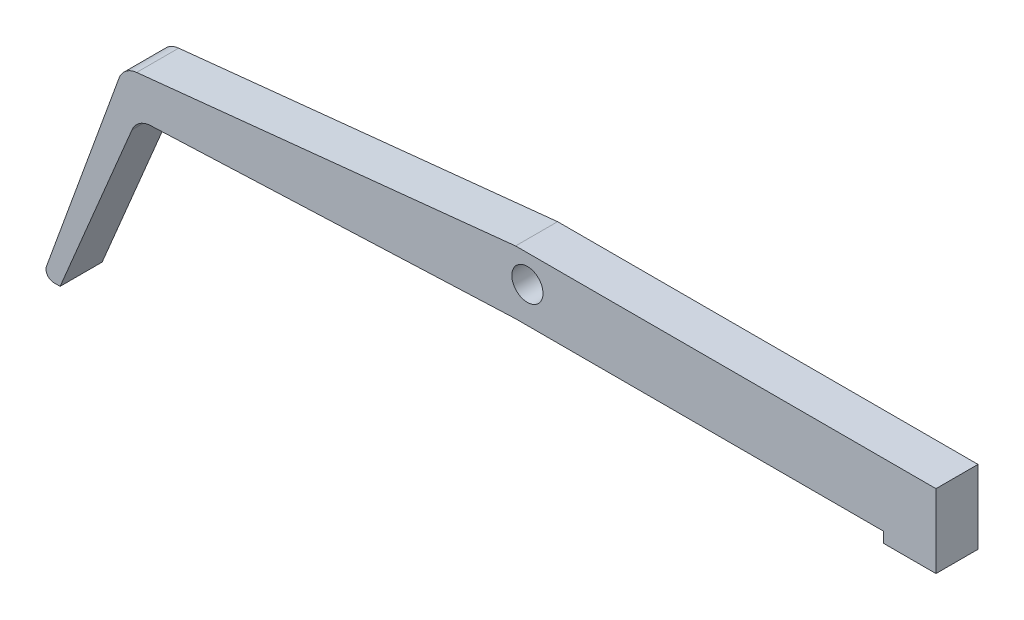
ISO-10303-21;
HEADER;
FILE_DESCRIPTION(('STEP AP214'),'2;1');
FILE_NAME('part.step','',(''),(''),'','','');
FILE_SCHEMA(('AUTOMOTIVE_DESIGN { 1 0 10303 214 1 1 1 1 }'));
ENDSEC;
DATA;
#1=APPLICATION_CONTEXT('core data for automotive mechanical design processes');
#2=APPLICATION_PROTOCOL_DEFINITION('international standard','automotive_design',2000,#1);
#3=PRODUCT_CONTEXT('',#1,'mechanical');
#4=PRODUCT('Part','Part','',(#3));
#5=PRODUCT_RELATED_PRODUCT_CATEGORY('part','',(#4));
#6=PRODUCT_DEFINITION_FORMATION('','',#4);
#7=PRODUCT_DEFINITION_CONTEXT('part definition',#1,'design');
#8=PRODUCT_DEFINITION('design','',#6,#7);
#9=PRODUCT_DEFINITION_SHAPE('','',#8);
#10=(LENGTH_UNIT() NAMED_UNIT(*) SI_UNIT(.MILLI.,.METRE.));
#11=(NAMED_UNIT(*) PLANE_ANGLE_UNIT() SI_UNIT($,.RADIAN.));
#12=(NAMED_UNIT(*) SI_UNIT($,.STERADIAN.) SOLID_ANGLE_UNIT());
#13=UNCERTAINTY_MEASURE_WITH_UNIT(LENGTH_MEASURE(1.E-05),#10,'distance_accuracy_value','');
#14=(GEOMETRIC_REPRESENTATION_CONTEXT(3) GLOBAL_UNCERTAINTY_ASSIGNED_CONTEXT((#13)) GLOBAL_UNIT_ASSIGNED_CONTEXT((#10,
#11,#12)) REPRESENTATION_CONTEXT('',''));
#15=CARTESIAN_POINT('',(0.,0.,0.));
#16=DIRECTION('',(0.,0.,1.));
#17=DIRECTION('',(1.,0.,0.));
#18=AXIS2_PLACEMENT_3D('',#15,#16,#17);
#19=CARTESIAN_POINT('',(77.7468093093093,38.75,8.));
#20=DIRECTION('',(-1.,0.,0.));
#21=DIRECTION('',(0.,0.,1.));
#22=AXIS2_PLACEMENT_3D('',#19,#20,#21);
#23=PLANE('',#22);
#24=DIRECTION('',(0.,1.,0.));
#25=VECTOR('',#24,1.);
#26=CARTESIAN_POINT('',(77.7468093093093,38.75,0.));
#27=LINE('',#26,#25);
#28=CARTESIAN_POINT('',(77.7468093093093,24.75,0.));
#29=VERTEX_POINT('',#28);
#30=CARTESIAN_POINT('',(77.7468093093093,38.75,0.));
#31=VERTEX_POINT('',#30);
#32=EDGE_CURVE('E172',#29,#31,#27,.T.);
#33=ORIENTED_EDGE('',*,*,#32,.T.);
#34=DIRECTION('',(0.,0.,-1.));
#35=VECTOR('',#34,1.);
#36=CARTESIAN_POINT('',(77.7468093093093,38.75,8.));
#37=LINE('',#36,#35);
#38=CARTESIAN_POINT('',(77.7468093093093,38.75,8.));
#39=VERTEX_POINT('',#38);
#40=EDGE_CURVE('E312',#39,#31,#37,.T.);
#41=ORIENTED_EDGE('',*,*,#40,.F.);
#42=DIRECTION('',(0.,1.,0.));
#43=VECTOR('',#42,1.);
#44=CARTESIAN_POINT('',(77.7468093093093,38.75,8.));
#45=LINE('',#44,#43);
#46=CARTESIAN_POINT('',(77.7468093093093,24.75,8.));
#47=VERTEX_POINT('',#46);
#48=EDGE_CURVE('E246',#47,#39,#45,.T.);
#49=ORIENTED_EDGE('',*,*,#48,.F.);
#50=DIRECTION('',(0.,0.,1.));
#51=VECTOR('',#50,1.);
#52=CARTESIAN_POINT('',(77.7468093093093,24.75,0.));
#53=LINE('',#52,#51);
#54=EDGE_CURVE('E209',#29,#47,#53,.T.);
#55=ORIENTED_EDGE('',*,*,#54,.F.);
#56=EDGE_LOOP('',(#33,#41,#49,#55));
#57=FACE_BOUND('',#56,.T.);
#58=ADVANCED_FACE('F41',(#57),#23,.F.);
#59=CARTESIAN_POINT('',(77.7468093093093,38.75,8.));
#60=DIRECTION('',(0.,-1.,0.));
#61=DIRECTION('',(0.,0.,-1.));
#62=AXIS2_PLACEMENT_3D('',#59,#60,#61);
#63=PLANE('',#62);
#64=DIRECTION('',(-1.,0.,0.));
#65=VECTOR('',#64,1.);
#66=CARTESIAN_POINT('',(77.7468093093093,38.75,0.));
#67=LINE('',#66,#65);
#68=CARTESIAN_POINT('',(-2.25319069069069,38.75,0.));
#69=VERTEX_POINT('',#68);
#70=EDGE_CURVE('E279',#31,#69,#67,.T.);
#71=ORIENTED_EDGE('',*,*,#70,.T.);
#72=DIRECTION('',(0.,0.,-1.));
#73=VECTOR('',#72,1.);
#74=CARTESIAN_POINT('',(-2.25319069069069,38.75,8.));
#75=LINE('',#74,#73);
#76=CARTESIAN_POINT('',(-2.25319069069069,38.75,8.));
#77=VERTEX_POINT('',#76);
#78=EDGE_CURVE('E308',#77,#69,#75,.T.);
#79=ORIENTED_EDGE('',*,*,#78,.F.);
#80=DIRECTION('',(-1.,0.,0.));
#81=VECTOR('',#80,1.);
#82=CARTESIAN_POINT('',(77.7468093093093,38.75,8.));
#83=LINE('',#82,#81);
#84=EDGE_CURVE('E250',#39,#77,#83,.T.);
#85=ORIENTED_EDGE('',*,*,#84,.F.);
#86=ORIENTED_EDGE('',*,*,#40,.T.);
#87=EDGE_LOOP('',(#71,#79,#85,#86));
#88=FACE_BOUND('',#87,.T.);
#89=ADVANCED_FACE('F392',(#88),#63,.F.);
#90=CARTESIAN_POINT('',(-2.25319069069069,38.75,8.));
#91=DIRECTION('',(0.102885577031586,-0.994693197945416,0.));
#92=DIRECTION('',(0.994693197945416,0.102885577031586,0.));
#93=AXIS2_PLACEMENT_3D('',#90,#91,#92);
#94=PLANE('',#93);
#95=DIRECTION('',(-0.994693197945415,-0.102885577031586,0.));
#96=VECTOR('',#95,1.);
#97=CARTESIAN_POINT('',(-2.25319069069069,38.75,0.));
#98=LINE('',#97,#96);
#99=CARTESIAN_POINT('',(-74.3648610289055,31.2911666343114,0.));
#100=VERTEX_POINT('',#99);
#101=EDGE_CURVE('E282',#69,#100,#98,.T.);
#102=ORIENTED_EDGE('',*,*,#101,.T.);
#103=DIRECTION('',(0.,0.,-1.));
#104=VECTOR('',#103,1.);
#105=CARTESIAN_POINT('',(-74.3648610289055,31.2911666343114,8.));
#106=LINE('',#105,#104);
#107=CARTESIAN_POINT('',(-74.3648610289055,31.2911666343114,8.));
#108=VERTEX_POINT('',#107);
#109=EDGE_CURVE('E330',#100,#108,#106,.F.);
#110=ORIENTED_EDGE('',*,*,#109,.T.);
#111=DIRECTION('',(-0.994693197945415,-0.102885577031586,0.));
#112=VECTOR('',#111,1.);
#113=CARTESIAN_POINT('',(-2.25319069069069,38.75,8.));
#114=LINE('',#113,#112);
#115=EDGE_CURVE('E254',#77,#108,#114,.T.);
#116=ORIENTED_EDGE('',*,*,#115,.F.);
#117=ORIENTED_EDGE('',*,*,#78,.T.);
#118=EDGE_LOOP('',(#102,#110,#116,#117));
#119=FACE_BOUND('',#118,.T.);
#120=ADVANCED_FACE('F398',(#119),#94,.F.);
#121=CARTESIAN_POINT('',(-76.8551805365968,31.0335817226311,8.));
#122=DIRECTION('',(0.939635149391802,-0.342178003424307,0.));
#123=DIRECTION('',(0.342178003424307,0.939635149391802,0.));
#124=AXIS2_PLACEMENT_3D('',#121,#122,#123);
#125=PLANE('',#124);
#126=DIRECTION('',(-0.342178003424307,-0.939635149391802,0.));
#127=VECTOR('',#126,1.);
#128=CARTESIAN_POINT('',(-76.8551805365968,31.0335817226311,0.));
#129=LINE('',#128,#127);
#130=CARTESIAN_POINT('',(-77.7118593183464,28.681105856227,0.));
#131=VERTEX_POINT('',#130);
#132=CARTESIAN_POINT('',(-91.5200383765999,-9.23673299486357,0.));
#133=VERTEX_POINT('',#132);
#134=EDGE_CURVE('E286',#131,#133,#129,.T.);
#135=ORIENTED_EDGE('',*,*,#134,.T.);
#136=DIRECTION('',(0.,0.,-1.));
#137=VECTOR('',#136,1.);
#138=CARTESIAN_POINT('',(-91.5200383765999,-9.23673299486357,8.));
#139=LINE('',#138,#137);
#140=CARTESIAN_POINT('',(-91.5200383765999,-9.23673299486357,8.));
#141=VERTEX_POINT('',#140);
#142=EDGE_CURVE('E50',#133,#141,#139,.F.);
#143=ORIENTED_EDGE('',*,*,#142,.T.);
#144=DIRECTION('',(-0.342178003424307,-0.939635149391802,0.));
#145=VECTOR('',#144,1.);
#146=CARTESIAN_POINT('',(-76.8551805365968,31.0335817226311,8.));
#147=LINE('',#146,#145);
#148=CARTESIAN_POINT('',(-77.7118593183464,28.681105856227,8.));
#149=VERTEX_POINT('',#148);
#150=EDGE_CURVE('E258',#149,#141,#147,.T.);
#151=ORIENTED_EDGE('',*,*,#150,.F.);
#152=DIRECTION('',(0.,0.,-1.));
#153=VECTOR('',#152,1.);
#154=CARTESIAN_POINT('',(-77.7118593183464,28.681105856227,8.));
#155=LINE('',#154,#153);
#156=EDGE_CURVE('E323',#149,#131,#155,.T.);
#157=ORIENTED_EDGE('',*,*,#156,.T.);
#158=EDGE_LOOP('',(#135,#143,#151,#157));
#159=FACE_BOUND('',#158,.T.);
#160=ADVANCED_FACE('F417',(#159),#125,.F.);
#161=CARTESIAN_POINT('',(-88.9231906906907,-11.25,8.));
#162=DIRECTION('',(0.,1.,0.));
#163=DIRECTION('',(-1.,0.,0.));
#164=AXIS2_PLACEMENT_3D('',#161,#162,#163);
#165=PLANE('',#164);
#166=DIRECTION('',(1.,0.,0.));
#167=VECTOR('',#166,1.);
#168=CARTESIAN_POINT('',(-88.9231906906907,-11.25,8.));
#169=LINE('',#168,#167);
#170=CARTESIAN_POINT('',(-90.1105856525122,-11.25,8.));
#171=VERTEX_POINT('',#170);
#172=CARTESIAN_POINT('',(-88.9231906906907,-11.25,8.));
#173=VERTEX_POINT('',#172);
#174=EDGE_CURVE('E261',#171,#173,#169,.T.);
#175=ORIENTED_EDGE('',*,*,#174,.F.);
#176=DIRECTION('',(0.,0.,-1.));
#177=VECTOR('',#176,1.);
#178=CARTESIAN_POINT('',(-90.1105856525122,-11.25,8.));
#179=LINE('',#178,#177);
#180=CARTESIAN_POINT('',(-90.1105856525122,-11.25,0.));
#181=VERTEX_POINT('',#180);
#182=EDGE_CURVE('E342',#171,#181,#179,.T.);
#183=ORIENTED_EDGE('',*,*,#182,.T.);
#184=DIRECTION('',(1.,0.,0.));
#185=VECTOR('',#184,1.);
#186=CARTESIAN_POINT('',(-88.9231906906907,-11.25,0.));
#187=LINE('',#186,#185);
#188=CARTESIAN_POINT('',(-88.9231906906907,-11.25,0.));
#189=VERTEX_POINT('',#188);
#190=EDGE_CURVE('E289',#181,#189,#187,.T.);
#191=ORIENTED_EDGE('',*,*,#190,.T.);
#192=DIRECTION('',(0.,0.,-1.));
#193=VECTOR('',#192,1.);
#194=CARTESIAN_POINT('',(-88.9231906906907,-11.25,8.));
#195=LINE('',#194,#193);
#196=EDGE_CURVE('E304',#173,#189,#195,.T.);
#197=ORIENTED_EDGE('',*,*,#196,.F.);
#198=EDGE_LOOP('',(#175,#183,#191,#197));
#199=FACE_BOUND('',#198,.T.);
#200=ADVANCED_FACE('F351',(#199),#165,.F.);
#201=CARTESIAN_POINT('',(-74.2531906906907,23.75,8.));
#202=DIRECTION('',(-0.922264090472131,0.386560405920747,0.));
#203=DIRECTION('',(-0.386560405920747,-0.922264090472131,0.));
#204=AXIS2_PLACEMENT_3D('',#201,#202,#203);
#205=PLANE('',#204);
#206=DIRECTION('',(0.386560405920747,0.922264090472131,0.));
#207=VECTOR('',#206,1.);
#208=CARTESIAN_POINT('',(-74.2531906906907,23.75,0.));
#209=LINE('',#208,#207);
#210=CARTESIAN_POINT('',(-75.2358555182941,21.4055372211234,0.));
#211=VERTEX_POINT('',#210);
#212=EDGE_CURVE('E292',#189,#211,#209,.T.);
#213=ORIENTED_EDGE('',*,*,#212,.T.);
#214=DIRECTION('',(0.,0.,-1.));
#215=VECTOR('',#214,1.);
#216=CARTESIAN_POINT('',(-75.2358555182941,21.4055372211234,8.));
#217=LINE('',#216,#215);
#218=CARTESIAN_POINT('',(-75.2358555182941,21.4055372211234,8.));
#219=VERTEX_POINT('',#218);
#220=EDGE_CURVE('E320',#211,#219,#217,.F.);
#221=ORIENTED_EDGE('',*,*,#220,.T.);
#222=DIRECTION('',(0.386560405920747,0.922264090472131,0.));
#223=VECTOR('',#222,1.);
#224=CARTESIAN_POINT('',(-74.2531906906907,23.75,8.));
#225=LINE('',#224,#223);
#226=EDGE_CURVE('E264',#173,#219,#225,.T.);
#227=ORIENTED_EDGE('',*,*,#226,.F.);
#228=ORIENTED_EDGE('',*,*,#196,.T.);
#229=EDGE_LOOP('',(#213,#221,#227,#228));
#230=FACE_BOUND('',#229,.T.);
#231=ADVANCED_FACE('F360',(#230),#205,.F.);
#232=CARTESIAN_POINT('',(-2.25319069069069,26.75,8.));
#233=DIRECTION('',(-0.0416305447121813,0.999133073092352,0.));
#234=DIRECTION('',(-0.999133073092352,-0.0416305447121813,0.));
#235=AXIS2_PLACEMENT_3D('',#232,#233,#234);
#236=PLANE('',#235);
#237=DIRECTION('',(0.999133073092352,0.0416305447121813,0.));
#238=VECTOR('',#237,1.);
#239=CARTESIAN_POINT('',(-2.25319069069069,26.75,8.));
#240=LINE('',#239,#238);
#241=CARTESIAN_POINT('',(-71.7133213352543,23.8558278898098,8.));
#242=VERTEX_POINT('',#241);
#243=CARTESIAN_POINT('',(-2.25319069069069,26.75,8.));
#244=VERTEX_POINT('',#243);
#245=EDGE_CURVE('E268',#242,#244,#240,.T.);
#246=ORIENTED_EDGE('',*,*,#245,.F.);
#247=DIRECTION('',(0.,0.,-1.));
#248=VECTOR('',#247,1.);
#249=CARTESIAN_POINT('',(-71.7133213352543,23.8558278898098,0.));
#250=LINE('',#249,#248);
#251=CARTESIAN_POINT('',(-71.7133213352543,23.8558278898098,0.));
#252=VERTEX_POINT('',#251);
#253=EDGE_CURVE('E316',#242,#252,#250,.T.);
#254=ORIENTED_EDGE('',*,*,#253,.T.);
#255=DIRECTION('',(0.999133073092352,0.0416305447121813,0.));
#256=VECTOR('',#255,1.);
#257=CARTESIAN_POINT('',(-2.25319069069069,26.75,0.));
#258=LINE('',#257,#256);
#259=CARTESIAN_POINT('',(-2.25319069069069,26.75,0.));
#260=VERTEX_POINT('',#259);
#261=EDGE_CURVE('E296',#252,#260,#258,.T.);
#262=ORIENTED_EDGE('',*,*,#261,.T.);
#263=DIRECTION('',(0.,0.,-1.));
#264=VECTOR('',#263,1.);
#265=CARTESIAN_POINT('',(-2.25319069069069,26.75,8.));
#266=LINE('',#265,#264);
#267=EDGE_CURVE('E275',#244,#260,#266,.T.);
#268=ORIENTED_EDGE('',*,*,#267,.F.);
#269=EDGE_LOOP('',(#246,#254,#262,#268));
#270=FACE_BOUND('',#269,.T.);
#271=ADVANCED_FACE('F371',(#270),#236,.F.);
#272=CARTESIAN_POINT('',(77.7468093093093,26.75,8.));
#273=DIRECTION('',(0.,1.,0.));
#274=DIRECTION('',(0.,0.,1.));
#275=AXIS2_PLACEMENT_3D('',#272,#273,#274);
#276=PLANE('',#275);
#277=DIRECTION('',(1.,0.,0.));
#278=VECTOR('',#277,1.);
#279=CARTESIAN_POINT('',(77.7468093093093,26.75,0.));
#280=LINE('',#279,#278);
#281=CARTESIAN_POINT('',(67.7468093093093,26.75,0.));
#282=VERTEX_POINT('',#281);
#283=EDGE_CURVE('E251',#260,#282,#280,.T.);
#284=ORIENTED_EDGE('',*,*,#283,.T.);
#285=DIRECTION('',(0.,0.,1.));
#286=VECTOR('',#285,1.);
#287=CARTESIAN_POINT('',(67.7468093093093,26.75,0.));
#288=LINE('',#287,#286);
#289=CARTESIAN_POINT('',(67.7468093093093,26.75,1.6));
#290=VERTEX_POINT('',#289);
#291=EDGE_CURVE('E193',#282,#290,#288,.T.);
#292=ORIENTED_EDGE('',*,*,#291,.T.);
#293=DIRECTION('',(-1.,0.,0.));
#294=VECTOR('',#293,1.);
#295=CARTESIAN_POINT('',(0.,26.75,1.60000000000001));
#296=LINE('',#295,#294);
#297=CARTESIAN_POINT('',(76.1468093093093,26.75,1.6));
#298=VERTEX_POINT('',#297);
#299=EDGE_CURVE('E224',#298,#290,#296,.T.);
#300=ORIENTED_EDGE('',*,*,#299,.F.);
#301=DIRECTION('',(0.,0.,-1.));
#302=VECTOR('',#301,1.);
#303=CARTESIAN_POINT('',(76.1468093093093,26.75,0.));
#304=LINE('',#303,#302);
#305=CARTESIAN_POINT('',(76.1468093093093,26.75,6.4));
#306=VERTEX_POINT('',#305);
#307=EDGE_CURVE('E221',#306,#298,#304,.T.);
#308=ORIENTED_EDGE('',*,*,#307,.F.);
#309=DIRECTION('',(-1.,0.,0.));
#310=VECTOR('',#309,1.);
#311=CARTESIAN_POINT('',(0.,26.75,6.39999999999999));
#312=LINE('',#311,#310);
#313=CARTESIAN_POINT('',(67.7468093093093,26.75,6.4));
#314=VERTEX_POINT('',#313);
#315=EDGE_CURVE('E168',#306,#314,#312,.T.);
#316=ORIENTED_EDGE('',*,*,#315,.T.);
#317=DIRECTION('',(0.,0.,-1.));
#318=VECTOR('',#317,1.);
#319=CARTESIAN_POINT('',(67.7468093093093,26.75,0.));
#320=LINE('',#319,#318);
#321=CARTESIAN_POINT('',(67.7468093093093,26.75,8.));
#322=VERTEX_POINT('',#321);
#323=EDGE_CURVE('E189',#322,#314,#320,.T.);
#324=ORIENTED_EDGE('',*,*,#323,.F.);
#325=DIRECTION('',(1.,0.,0.));
#326=VECTOR('',#325,1.);
#327=CARTESIAN_POINT('',(77.7468093093093,26.75,8.));
#328=LINE('',#327,#326);
#329=EDGE_CURVE('E271',#244,#322,#328,.T.);
#330=ORIENTED_EDGE('',*,*,#329,.F.);
#331=ORIENTED_EDGE('',*,*,#267,.T.);
#332=EDGE_LOOP('',(#284,#292,#300,#308,#316,#324,#330,#331));
#333=FACE_BOUND('',#332,.T.);
#334=ADVANCED_FACE('F375',(#333),#276,.F.);
#335=CARTESIAN_POINT('',(0.,0.,8.));
#336=DIRECTION('',(0.,0.,-1.));
#337=DIRECTION('',(-1.,0.,0.));
#338=AXIS2_PLACEMENT_3D('',#335,#336,#337);
#339=PLANE('',#338);
#340=CARTESIAN_POINT('',(0.,33.532902176458,8.));
#341=DIRECTION('',(0.,0.,-1.));
#342=DIRECTION('',(-1.,0.,0.));
#343=AXIS2_PLACEMENT_3D('',#340,#341,#342);
#344=CIRCLE('',#343,2.96650393068115);
#345=CARTESIAN_POINT('',(-2.96650393068115,33.532902176458,8.));
#346=VERTEX_POINT('',#345);
#347=EDGE_CURVE('E196',#346,#346,#344,.T.);
#348=ORIENTED_EDGE('',*,*,#347,.T.);
#349=EDGE_LOOP('',(#348));
#350=FACE_BOUND('',#349,.T.);
#351=ORIENTED_EDGE('',*,*,#150,.T.);
#352=CARTESIAN_POINT('',(-90.1105856525122,-9.75000000000003,8.));
#353=DIRECTION('',(0.,0.,-1.));
#354=DIRECTION('',(-1.,0.,0.));
#355=AXIS2_PLACEMENT_3D('',#352,#353,#354);
#356=CIRCLE('',#355,1.5);
#357=EDGE_CURVE('E11',#141,#171,#356,.F.);
#358=ORIENTED_EDGE('',*,*,#357,.T.);
#359=ORIENTED_EDGE('',*,*,#174,.T.);
#360=ORIENTED_EDGE('',*,*,#226,.T.);
#361=CARTESIAN_POINT('',(-71.5467991564056,19.8592955974404,8.));
#362=DIRECTION('',(0.,0.,-1.));
#363=DIRECTION('',(-1.,0.,0.));
#364=AXIS2_PLACEMENT_3D('',#361,#362,#363);
#365=CIRCLE('',#364,4.);
#366=EDGE_CURVE('E339',#219,#242,#365,.T.);
#367=ORIENTED_EDGE('',*,*,#366,.T.);
#368=ORIENTED_EDGE('',*,*,#245,.T.);
#369=ORIENTED_EDGE('',*,*,#329,.T.);
#370=DIRECTION('',(0.,1.,0.));
#371=VECTOR('',#370,1.);
#372=CARTESIAN_POINT('',(67.7468093093093,24.75,8.));
#373=LINE('',#372,#371);
#374=CARTESIAN_POINT('',(67.7468093093093,24.75,8.));
#375=VERTEX_POINT('',#374);
#376=EDGE_CURVE('E232',#375,#322,#373,.T.);
#377=ORIENTED_EDGE('',*,*,#376,.F.);
#378=DIRECTION('',(-1.,0.,0.));
#379=VECTOR('',#378,1.);
#380=CARTESIAN_POINT('',(0.,24.75,8.));
#381=LINE('',#380,#379);
#382=EDGE_CURVE('E213',#47,#375,#381,.T.);
#383=ORIENTED_EDGE('',*,*,#382,.F.);
#384=ORIENTED_EDGE('',*,*,#48,.T.);
#385=ORIENTED_EDGE('',*,*,#84,.T.);
#386=ORIENTED_EDGE('',*,*,#115,.T.);
#387=CARTESIAN_POINT('',(-73.9533187207792,27.3123938425298,8.));
#388=DIRECTION('',(0.,0.,-1.));
#389=DIRECTION('',(-1.,0.,0.));
#390=AXIS2_PLACEMENT_3D('',#387,#388,#389);
#391=CIRCLE('',#390,4.);
#392=EDGE_CURVE('E333',#108,#149,#391,.F.);
#393=ORIENTED_EDGE('',*,*,#392,.T.);
#394=EDGE_LOOP('',(#351,#358,#359,#360,#367,#368,#369,#377,#383,#384,#385,#386,#393));
#395=FACE_BOUND('',#394,.T.);
#396=ADVANCED_FACE('F368',(#350,#395),#339,.F.);
#397=CARTESIAN_POINT('',(0.,0.,0.));
#398=DIRECTION('',(0.,0.,-1.));
#399=DIRECTION('',(-1.,0.,0.));
#400=AXIS2_PLACEMENT_3D('',#397,#398,#399);
#401=PLANE('',#400);
#402=CARTESIAN_POINT('',(0.,33.532902176458,0.));
#403=DIRECTION('',(0.,0.,1.));
#404=DIRECTION('',(1.,0.,0.));
#405=AXIS2_PLACEMENT_3D('',#402,#403,#404);
#406=CIRCLE('',#405,2.96650393068115);
#407=CARTESIAN_POINT('',(2.96650393068115,33.532902176458,0.));
#408=VERTEX_POINT('',#407);
#409=EDGE_CURVE('E604',#408,#408,#406,.T.);
#410=ORIENTED_EDGE('',*,*,#409,.T.);
#411=EDGE_LOOP('',(#410));
#412=FACE_BOUND('',#411,.T.);
#413=ORIENTED_EDGE('',*,*,#190,.F.);
#414=CARTESIAN_POINT('',(-90.1105856525122,-9.75000000000003,0.));
#415=DIRECTION('',(0.,0.,-1.));
#416=DIRECTION('',(-1.,0.,0.));
#417=AXIS2_PLACEMENT_3D('',#414,#415,#416);
#418=CIRCLE('',#417,1.5);
#419=EDGE_CURVE('E64',#181,#133,#418,.T.);
#420=ORIENTED_EDGE('',*,*,#419,.T.);
#421=ORIENTED_EDGE('',*,*,#134,.F.);
#422=CARTESIAN_POINT('',(-73.9533187207792,27.3123938425298,0.));
#423=DIRECTION('',(0.,0.,-1.));
#424=DIRECTION('',(-1.,0.,0.));
#425=AXIS2_PLACEMENT_3D('',#422,#423,#424);
#426=CIRCLE('',#425,4.);
#427=EDGE_CURVE('E327',#131,#100,#426,.T.);
#428=ORIENTED_EDGE('',*,*,#427,.T.);
#429=ORIENTED_EDGE('',*,*,#101,.F.);
#430=ORIENTED_EDGE('',*,*,#70,.F.);
#431=ORIENTED_EDGE('',*,*,#32,.F.);
#432=DIRECTION('',(1.,0.,0.));
#433=VECTOR('',#432,1.);
#434=CARTESIAN_POINT('',(0.,24.75,0.));
#435=LINE('',#434,#433);
#436=CARTESIAN_POINT('',(67.7468093093093,24.75,0.));
#437=VERTEX_POINT('',#436);
#438=EDGE_CURVE('E205',#437,#29,#435,.T.);
#439=ORIENTED_EDGE('',*,*,#438,.F.);
#440=DIRECTION('',(0.,1.,0.));
#441=VECTOR('',#440,1.);
#442=CARTESIAN_POINT('',(67.7468093093093,24.75,0.));
#443=LINE('',#442,#441);
#444=EDGE_CURVE('E236',#437,#282,#443,.T.);
#445=ORIENTED_EDGE('',*,*,#444,.T.);
#446=ORIENTED_EDGE('',*,*,#283,.F.);
#447=ORIENTED_EDGE('',*,*,#261,.F.);
#448=CARTESIAN_POINT('',(-71.5467991564056,19.8592955974404,0.));
#449=DIRECTION('',(0.,0.,-1.));
#450=DIRECTION('',(-1.,0.,0.));
#451=AXIS2_PLACEMENT_3D('',#448,#449,#450);
#452=CIRCLE('',#451,4.);
#453=EDGE_CURVE('E336',#252,#211,#452,.F.);
#454=ORIENTED_EDGE('',*,*,#453,.T.);
#455=ORIENTED_EDGE('',*,*,#212,.F.);
#456=EDGE_LOOP('',(#413,#420,#421,#428,#429,#430,#431,#439,#445,#446,#447,#454,#455));
#457=FACE_BOUND('',#456,.T.);
#458=ADVANCED_FACE('F356',(#412,#457),#401,.T.);
#459=CARTESIAN_POINT('',(0.,24.75,6.39999999999999));
#460=DIRECTION('',(0.,0.,-1.));
#461=DIRECTION('',(-1.,0.,0.));
#462=AXIS2_PLACEMENT_3D('',#459,#460,#461);
#463=PLANE('',#462);
#464=ORIENTED_EDGE('',*,*,#315,.F.);
#465=DIRECTION('',(0.,1.,0.));
#466=VECTOR('',#465,1.);
#467=CARTESIAN_POINT('',(76.1468093093093,24.75,6.4));
#468=LINE('',#467,#466);
#469=CARTESIAN_POINT('',(76.1468093093093,24.75,6.4));
#470=VERTEX_POINT('',#469);
#471=EDGE_CURVE('E162',#470,#306,#468,.T.);
#472=ORIENTED_EDGE('',*,*,#471,.F.);
#473=DIRECTION('',(-1.,0.,0.));
#474=VECTOR('',#473,1.);
#475=CARTESIAN_POINT('',(0.,24.75,6.39999999999999));
#476=LINE('',#475,#474);
#477=CARTESIAN_POINT('',(67.7468093093093,24.75,6.4));
#478=VERTEX_POINT('',#477);
#479=EDGE_CURVE('E167',#470,#478,#476,.T.);
#480=ORIENTED_EDGE('',*,*,#479,.T.);
#481=DIRECTION('',(0.,1.,0.));
#482=VECTOR('',#481,1.);
#483=CARTESIAN_POINT('',(67.7468093093093,24.75,6.4));
#484=LINE('',#483,#482);
#485=EDGE_CURVE('E218',#478,#314,#484,.T.);
#486=ORIENTED_EDGE('',*,*,#485,.T.);
#487=EDGE_LOOP('',(#464,#472,#480,#486));
#488=FACE_BOUND('',#487,.T.);
#489=ADVANCED_FACE('F164',(#488),#463,.T.);
#490=CARTESIAN_POINT('',(76.1468093093093,24.75,0.));
#491=DIRECTION('',(1.,0.,0.));
#492=DIRECTION('',(0.,0.,-1.));
#493=AXIS2_PLACEMENT_3D('',#490,#491,#492);
#494=PLANE('',#493);
#495=ORIENTED_EDGE('',*,*,#307,.T.);
#496=DIRECTION('',(0.,1.,0.));
#497=VECTOR('',#496,1.);
#498=CARTESIAN_POINT('',(76.1468093093093,24.75,1.6));
#499=LINE('',#498,#497);
#500=CARTESIAN_POINT('',(76.1468093093093,24.75,1.6));
#501=VERTEX_POINT('',#500);
#502=EDGE_CURVE('E173',#501,#298,#499,.T.);
#503=ORIENTED_EDGE('',*,*,#502,.F.);
#504=DIRECTION('',(0.,0.,-1.));
#505=VECTOR('',#504,1.);
#506=CARTESIAN_POINT('',(76.1468093093093,24.75,0.));
#507=LINE('',#506,#505);
#508=EDGE_CURVE('E176',#470,#501,#507,.T.);
#509=ORIENTED_EDGE('',*,*,#508,.F.);
#510=ORIENTED_EDGE('',*,*,#471,.T.);
#511=EDGE_LOOP('',(#495,#503,#509,#510));
#512=FACE_BOUND('',#511,.T.);
#513=ADVANCED_FACE('F177',(#512),#494,.F.);
#514=CARTESIAN_POINT('',(0.,24.75,1.60000000000001));
#515=DIRECTION('',(0.,0.,-1.));
#516=DIRECTION('',(-1.,0.,0.));
#517=AXIS2_PLACEMENT_3D('',#514,#515,#516);
#518=PLANE('',#517);
#519=ORIENTED_EDGE('',*,*,#299,.T.);
#520=DIRECTION('',(0.,1.,0.));
#521=VECTOR('',#520,1.);
#522=CARTESIAN_POINT('',(67.7468093093093,24.75,1.6));
#523=LINE('',#522,#521);
#524=CARTESIAN_POINT('',(67.7468093093093,24.75,1.6));
#525=VERTEX_POINT('',#524);
#526=EDGE_CURVE('E240',#525,#290,#523,.T.);
#527=ORIENTED_EDGE('',*,*,#526,.F.);
#528=DIRECTION('',(-1.,0.,0.));
#529=VECTOR('',#528,1.);
#530=CARTESIAN_POINT('',(0.,24.75,1.60000000000001));
#531=LINE('',#530,#529);
#532=EDGE_CURVE('E182',#501,#525,#531,.T.);
#533=ORIENTED_EDGE('',*,*,#532,.F.);
#534=ORIENTED_EDGE('',*,*,#502,.T.);
#535=EDGE_LOOP('',(#519,#527,#533,#534));
#536=FACE_BOUND('',#535,.T.);
#537=ADVANCED_FACE('F388',(#536),#518,.F.);
#538=CARTESIAN_POINT('',(67.7468093093093,24.75,0.));
#539=DIRECTION('',(-1.,0.,0.));
#540=DIRECTION('',(0.,0.,1.));
#541=AXIS2_PLACEMENT_3D('',#538,#539,#540);
#542=PLANE('',#541);
#543=ORIENTED_EDGE('',*,*,#291,.F.);
#544=ORIENTED_EDGE('',*,*,#444,.F.);
#545=DIRECTION('',(0.,0.,1.));
#546=VECTOR('',#545,1.);
#547=CARTESIAN_POINT('',(67.7468093093093,24.75,0.));
#548=LINE('',#547,#546);
#549=EDGE_CURVE('E201',#437,#525,#548,.T.);
#550=ORIENTED_EDGE('',*,*,#549,.T.);
#551=ORIENTED_EDGE('',*,*,#526,.T.);
#552=EDGE_LOOP('',(#543,#544,#550,#551));
#553=FACE_BOUND('',#552,.T.);
#554=ADVANCED_FACE('F381',(#553),#542,.T.);
#555=CARTESIAN_POINT('',(67.7468093093093,24.75,0.));
#556=DIRECTION('',(1.,0.,0.));
#557=DIRECTION('',(0.,0.,-1.));
#558=AXIS2_PLACEMENT_3D('',#555,#556,#557);
#559=PLANE('',#558);
#560=ORIENTED_EDGE('',*,*,#323,.T.);
#561=ORIENTED_EDGE('',*,*,#485,.F.);
#562=DIRECTION('',(0.,0.,-1.));
#563=VECTOR('',#562,1.);
#564=CARTESIAN_POINT('',(67.7468093093093,24.75,0.));
#565=LINE('',#564,#563);
#566=EDGE_CURVE('E186',#375,#478,#565,.T.);
#567=ORIENTED_EDGE('',*,*,#566,.F.);
#568=ORIENTED_EDGE('',*,*,#376,.T.);
#569=EDGE_LOOP('',(#560,#561,#567,#568));
#570=FACE_BOUND('',#569,.T.);
#571=ADVANCED_FACE('F379',(#570),#559,.F.);
#572=CARTESIAN_POINT('',(0.,24.75,0.));
#573=DIRECTION('',(0.,-1.,0.));
#574=DIRECTION('',(0.,0.,-1.));
#575=AXIS2_PLACEMENT_3D('',#572,#573,#574);
#576=PLANE('',#575);
#577=ORIENTED_EDGE('',*,*,#479,.F.);
#578=ORIENTED_EDGE('',*,*,#508,.T.);
#579=ORIENTED_EDGE('',*,*,#532,.T.);
#580=ORIENTED_EDGE('',*,*,#549,.F.);
#581=ORIENTED_EDGE('',*,*,#438,.T.);
#582=ORIENTED_EDGE('',*,*,#54,.T.);
#583=ORIENTED_EDGE('',*,*,#382,.T.);
#584=ORIENTED_EDGE('',*,*,#566,.T.);
#585=EDGE_LOOP('',(#577,#578,#579,#580,#581,#582,#583,#584));
#586=FACE_BOUND('',#585,.T.);
#587=ADVANCED_FACE('F184',(#586),#576,.T.);
#588=CARTESIAN_POINT('',(-71.5467991564056,19.8592955974404,8.));
#589=DIRECTION('',(0.,0.,1.));
#590=DIRECTION('',(1.,0.,0.));
#591=AXIS2_PLACEMENT_3D('',#588,#589,#590);
#592=CYLINDRICAL_SURFACE('',#591,4.);
#593=ORIENTED_EDGE('',*,*,#366,.F.);
#594=ORIENTED_EDGE('',*,*,#220,.F.);
#595=ORIENTED_EDGE('',*,*,#453,.F.);
#596=ORIENTED_EDGE('',*,*,#253,.F.);
#597=EDGE_LOOP('',(#593,#594,#595,#596));
#598=FACE_BOUND('',#597,.T.);
#599=ADVANCED_FACE('F364',(#598),#592,.F.);
#600=CARTESIAN_POINT('',(-73.9533187207792,27.3123938425298,8.));
#601=DIRECTION('',(0.,0.,-1.));
#602=DIRECTION('',(-1.,0.,0.));
#603=AXIS2_PLACEMENT_3D('',#600,#601,#602);
#604=CYLINDRICAL_SURFACE('',#603,4.);
#605=ORIENTED_EDGE('',*,*,#392,.F.);
#606=ORIENTED_EDGE('',*,*,#109,.F.);
#607=ORIENTED_EDGE('',*,*,#427,.F.);
#608=ORIENTED_EDGE('',*,*,#156,.F.);
#609=EDGE_LOOP('',(#605,#606,#607,#608));
#610=FACE_BOUND('',#609,.T.);
#611=ADVANCED_FACE('F404',(#610),#604,.T.);
#612=CARTESIAN_POINT('',(0.,33.532902176458,0.));
#613=DIRECTION('',(0.,0.,1.));
#614=DIRECTION('',(1.,0.,0.));
#615=AXIS2_PLACEMENT_3D('',#612,#613,#614);
#616=CYLINDRICAL_SURFACE('',#615,2.96650393068115);
#617=ORIENTED_EDGE('',*,*,#409,.F.);
#618=EDGE_LOOP('',(#617));
#619=FACE_BOUND('',#618,.T.);
#620=ORIENTED_EDGE('',*,*,#347,.F.);
#621=EDGE_LOOP('',(#620));
#622=FACE_BOUND('',#621,.T.);
#623=ADVANCED_FACE('F406',(#619,#622),#616,.F.);
#624=CARTESIAN_POINT('',(-90.1105856525122,-9.75000000000003,8.));
#625=DIRECTION('',(0.,0.,-1.));
#626=DIRECTION('',(-1.,0.,0.));
#627=AXIS2_PLACEMENT_3D('',#624,#625,#626);
#628=CYLINDRICAL_SURFACE('',#627,1.5);
#629=ORIENTED_EDGE('',*,*,#357,.F.);
#630=ORIENTED_EDGE('',*,*,#142,.F.);
#631=ORIENTED_EDGE('',*,*,#419,.F.);
#632=ORIENTED_EDGE('',*,*,#182,.F.);
#633=EDGE_LOOP('',(#629,#630,#631,#632));
#634=FACE_BOUND('',#633,.T.);
#635=ADVANCED_FACE('F43',(#634),#628,.T.);
#636=CLOSED_SHELL('',(#58,#89,#120,#160,#200,#231,#271,#334,#396,#458,#489,#513,#537,#554,#571,
#587,#599,#611,#623,#635));
#637=MANIFOLD_SOLID_BREP('B2',#636);
#638=ADVANCED_BREP_SHAPE_REPRESENTATION('',(#18,#637),#14);
#639=SHAPE_DEFINITION_REPRESENTATION(#9,#638);
ENDSEC;
END-ISO-10303-21;
